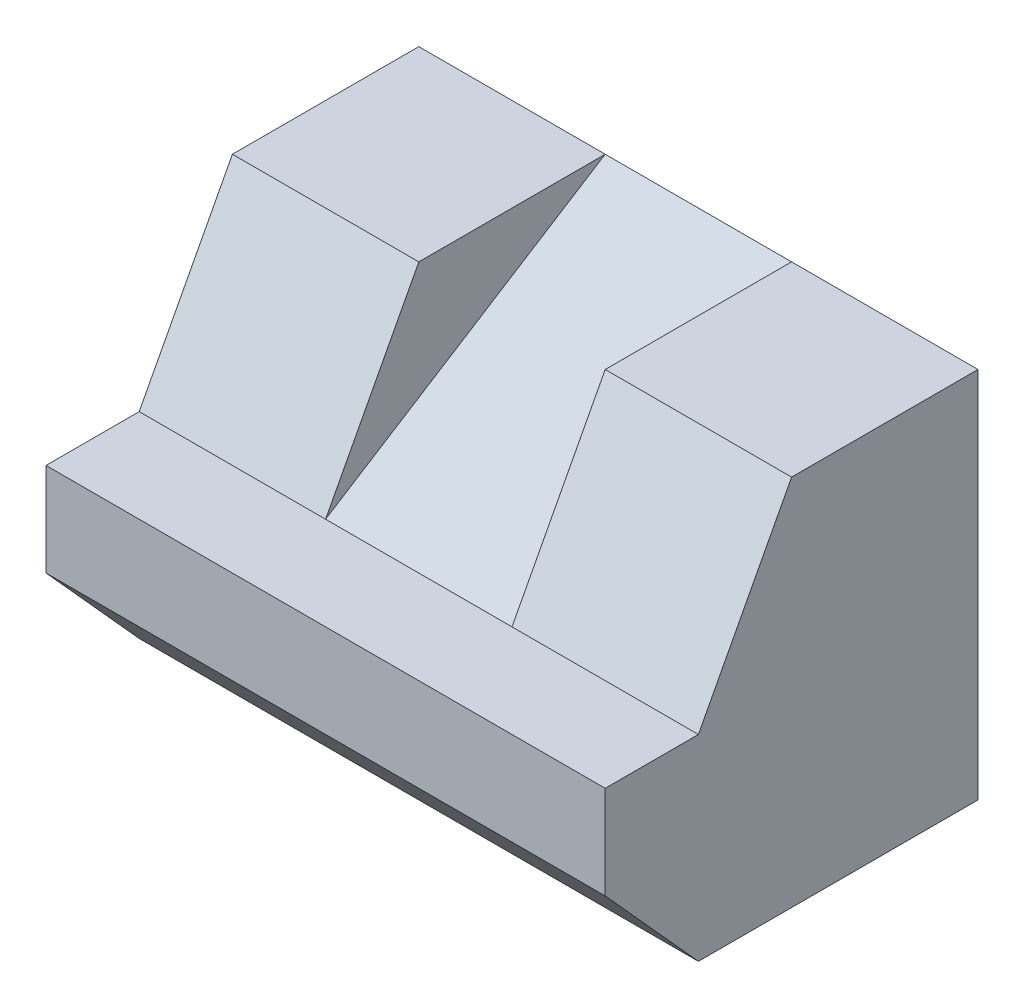
ISO-10303-21;
HEADER;
FILE_DESCRIPTION(('STEP AP214'),'2;1');
FILE_NAME('part.step','',(''),(''),'','','');
FILE_SCHEMA(('AUTOMOTIVE_DESIGN { 1 0 10303 214 1 1 1 1 }'));
ENDSEC;
DATA;
#1=APPLICATION_CONTEXT('core data for automotive mechanical design processes');
#2=APPLICATION_PROTOCOL_DEFINITION('international standard','automotive_design',2000,#1);
#3=PRODUCT_CONTEXT('',#1,'mechanical');
#4=PRODUCT('Part','Part','',(#3));
#5=PRODUCT_RELATED_PRODUCT_CATEGORY('part','',(#4));
#6=PRODUCT_DEFINITION_FORMATION('','',#4);
#7=PRODUCT_DEFINITION_CONTEXT('part definition',#1,'design');
#8=PRODUCT_DEFINITION('design','',#6,#7);
#9=PRODUCT_DEFINITION_SHAPE('','',#8);
#10=(LENGTH_UNIT() NAMED_UNIT(*) SI_UNIT(.MILLI.,.METRE.));
#11=(NAMED_UNIT(*) PLANE_ANGLE_UNIT() SI_UNIT($,.RADIAN.));
#12=(NAMED_UNIT(*) SI_UNIT($,.STERADIAN.) SOLID_ANGLE_UNIT());
#13=UNCERTAINTY_MEASURE_WITH_UNIT(LENGTH_MEASURE(1.E-05),#10,'distance_accuracy_value','');
#14=(GEOMETRIC_REPRESENTATION_CONTEXT(3) GLOBAL_UNCERTAINTY_ASSIGNED_CONTEXT((#13)) GLOBAL_UNIT_ASSIGNED_CONTEXT((#10,
#11,#12)) REPRESENTATION_CONTEXT('',''));
#15=CARTESIAN_POINT('',(0.,0.,0.));
#16=DIRECTION('',(0.,0.,1.));
#17=DIRECTION('',(1.,0.,0.));
#18=AXIS2_PLACEMENT_3D('',#15,#16,#17);
#19=CARTESIAN_POINT('',(76.2,50.8,0.));
#20=DIRECTION('',(0.,-1.,0.));
#21=DIRECTION('',(0.,0.,-1.));
#22=AXIS2_PLACEMENT_3D('',#19,#20,#21);
#23=PLANE('',#22);
#24=DIRECTION('',(0.,0.,1.));
#25=VECTOR('',#24,1.);
#26=CARTESIAN_POINT('',(50.8,50.8,0.));
#27=LINE('',#26,#25);
#28=CARTESIAN_POINT('',(50.8,50.8,0.));
#29=VERTEX_POINT('',#28);
#30=CARTESIAN_POINT('',(50.8,50.8,25.4));
#31=VERTEX_POINT('',#30);
#32=EDGE_CURVE('E208',#29,#31,#27,.T.);
#33=ORIENTED_EDGE('',*,*,#32,.T.);
#34=DIRECTION('',(-1.,0.,0.));
#35=VECTOR('',#34,1.);
#36=CARTESIAN_POINT('',(76.2,50.8,25.4));
#37=LINE('',#36,#35);
#38=CARTESIAN_POINT('',(76.2,50.8,25.4));
#39=VERTEX_POINT('',#38);
#40=EDGE_CURVE('E165',#39,#31,#37,.T.);
#41=ORIENTED_EDGE('',*,*,#40,.F.);
#42=DIRECTION('',(0.,0.,1.));
#43=VECTOR('',#42,1.);
#44=CARTESIAN_POINT('',(76.2,50.8,0.));
#45=LINE('',#44,#43);
#46=CARTESIAN_POINT('',(76.2,50.8,0.));
#47=VERTEX_POINT('',#46);
#48=EDGE_CURVE('E214',#47,#39,#45,.T.);
#49=ORIENTED_EDGE('',*,*,#48,.F.);
#50=DIRECTION('',(-1.,0.,0.));
#51=VECTOR('',#50,1.);
#52=CARTESIAN_POINT('',(76.2,50.8,0.));
#53=LINE('',#52,#51);
#54=EDGE_CURVE('E47',#47,#29,#53,.T.);
#55=ORIENTED_EDGE('',*,*,#54,.T.);
#56=EDGE_LOOP('',(#33,#41,#49,#55));
#57=FACE_BOUND('',#56,.T.);
#58=ADVANCED_FACE('F39',(#57),#23,.F.);
#59=CARTESIAN_POINT('',(76.2,50.8,25.4));
#60=DIRECTION('',(0.,-0.467351473788299,-0.884071603405462));
#61=DIRECTION('',(0.,0.884071603405462,-0.467351473788299));
#62=AXIS2_PLACEMENT_3D('',#59,#60,#61);
#63=PLANE('',#62);
#64=DIRECTION('',(0.,-0.884071603405462,0.467351473788299));
#65=VECTOR('',#64,1.);
#66=CARTESIAN_POINT('',(50.8,50.8,25.4));
#67=LINE('',#66,#65);
#68=CARTESIAN_POINT('',(50.8,26.7758768443826,38.1));
#69=VERTEX_POINT('',#68);
#70=EDGE_CURVE('E206',#31,#69,#67,.T.);
#71=ORIENTED_EDGE('',*,*,#70,.T.);
#72=DIRECTION('',(-1.,0.,0.));
#73=VECTOR('',#72,1.);
#74=CARTESIAN_POINT('',(76.2,26.7758768443826,38.1));
#75=LINE('',#74,#73);
#76=CARTESIAN_POINT('',(76.2,26.7758768443826,38.1));
#77=VERTEX_POINT('',#76);
#78=EDGE_CURVE('E162',#77,#69,#75,.T.);
#79=ORIENTED_EDGE('',*,*,#78,.F.);
#80=DIRECTION('',(0.,-0.884071603405462,0.467351473788299));
#81=VECTOR('',#80,1.);
#82=CARTESIAN_POINT('',(76.2,50.8,25.4));
#83=LINE('',#82,#81);
#84=EDGE_CURVE('E121',#39,#77,#83,.T.);
#85=ORIENTED_EDGE('',*,*,#84,.F.);
#86=ORIENTED_EDGE('',*,*,#40,.T.);
#87=EDGE_LOOP('',(#71,#79,#85,#86));
#88=FACE_BOUND('',#87,.T.);
#89=ADVANCED_FACE('F213',(#88),#63,.F.);
#90=CARTESIAN_POINT('',(76.2,0.,38.1));
#91=DIRECTION('',(0.,1.,0.));
#92=DIRECTION('',(0.,0.,1.));
#93=AXIS2_PLACEMENT_3D('',#90,#91,#92);
#94=PLANE('',#93);
#95=DIRECTION('',(0.,0.,-1.));
#96=VECTOR('',#95,1.);
#97=CARTESIAN_POINT('',(0.,0.,38.1));
#98=LINE('',#97,#96);
#99=CARTESIAN_POINT('',(0.,0.,38.1));
#100=VERTEX_POINT('',#99);
#101=CARTESIAN_POINT('',(0.,0.,0.));
#102=VERTEX_POINT('',#101);
#103=EDGE_CURVE('E142',#100,#102,#98,.T.);
#104=ORIENTED_EDGE('',*,*,#103,.T.);
#105=DIRECTION('',(-1.,0.,0.));
#106=VECTOR('',#105,1.);
#107=CARTESIAN_POINT('',(76.2,0.,0.));
#108=LINE('',#107,#106);
#109=CARTESIAN_POINT('',(76.2,0.,0.));
#110=VERTEX_POINT('',#109);
#111=EDGE_CURVE('E11',#110,#102,#108,.T.);
#112=ORIENTED_EDGE('',*,*,#111,.F.);
#113=DIRECTION('',(0.,0.,-1.));
#114=VECTOR('',#113,1.);
#115=CARTESIAN_POINT('',(76.2,0.,38.1));
#116=LINE('',#115,#114);
#117=CARTESIAN_POINT('',(76.2,0.,38.1));
#118=VERTEX_POINT('',#117);
#119=EDGE_CURVE('E159',#118,#110,#116,.T.);
#120=ORIENTED_EDGE('',*,*,#119,.F.);
#121=DIRECTION('',(-1.,0.,0.));
#122=VECTOR('',#121,1.);
#123=CARTESIAN_POINT('',(76.2,0.,38.1));
#124=LINE('',#123,#122);
#125=EDGE_CURVE('E138',#118,#100,#124,.T.);
#126=ORIENTED_EDGE('',*,*,#125,.T.);
#127=EDGE_LOOP('',(#104,#112,#120,#126));
#128=FACE_BOUND('',#127,.T.);
#129=ADVANCED_FACE('F41',(#128),#94,.F.);
#130=CARTESIAN_POINT('',(76.2,0.,0.));
#131=DIRECTION('',(0.,0.,1.));
#132=DIRECTION('',(1.,0.,0.));
#133=AXIS2_PLACEMENT_3D('',#130,#131,#132);
#134=PLANE('',#133);
#135=DIRECTION('',(0.,1.,0.));
#136=VECTOR('',#135,1.);
#137=CARTESIAN_POINT('',(0.,0.,0.));
#138=LINE('',#137,#136);
#139=CARTESIAN_POINT('',(0.,50.8,0.));
#140=VERTEX_POINT('',#139);
#141=EDGE_CURVE('E145',#102,#140,#138,.T.);
#142=ORIENTED_EDGE('',*,*,#141,.T.);
#143=CARTESIAN_POINT('',(25.4,50.8,0.));
#144=VERTEX_POINT('',#143);
#145=EDGE_CURVE('E167',#144,#140,#53,.T.);
#146=ORIENTED_EDGE('',*,*,#145,.F.);
#147=DIRECTION('',(1.,0.,0.));
#148=VECTOR('',#147,1.);
#149=CARTESIAN_POINT('',(25.4,50.8,0.));
#150=LINE('',#149,#148);
#151=EDGE_CURVE('E146',#144,#29,#150,.T.);
#152=ORIENTED_EDGE('',*,*,#151,.T.);
#153=ORIENTED_EDGE('',*,*,#54,.F.);
#154=DIRECTION('',(0.,1.,0.));
#155=VECTOR('',#154,1.);
#156=CARTESIAN_POINT('',(76.2,0.,0.));
#157=LINE('',#156,#155);
#158=EDGE_CURVE('E101',#110,#47,#157,.T.);
#159=ORIENTED_EDGE('',*,*,#158,.F.);
#160=ORIENTED_EDGE('',*,*,#111,.T.);
#161=EDGE_LOOP('',(#142,#146,#152,#153,#159,#160));
#162=FACE_BOUND('',#161,.T.);
#163=ADVANCED_FACE('F183',(#162),#134,.F.);
#164=CARTESIAN_POINT('',(25.4,50.8,25.4));
#165=VERTEX_POINT('',#164);
#166=CARTESIAN_POINT('',(0.,50.8,25.4));
#167=VERTEX_POINT('',#166);
#168=EDGE_CURVE('E164',#165,#167,#37,.T.);
#169=ORIENTED_EDGE('',*,*,#168,.F.);
#170=DIRECTION('',(0.,0.,1.));
#171=VECTOR('',#170,1.);
#172=CARTESIAN_POINT('',(25.4,50.8,0.));
#173=LINE('',#172,#171);
#174=EDGE_CURVE('E181',#144,#165,#173,.T.);
#175=ORIENTED_EDGE('',*,*,#174,.F.);
#176=ORIENTED_EDGE('',*,*,#145,.T.);
#177=DIRECTION('',(0.,0.,1.));
#178=VECTOR('',#177,1.);
#179=CARTESIAN_POINT('',(0.,50.8,0.));
#180=LINE('',#179,#178);
#181=EDGE_CURVE('E149',#140,#167,#180,.T.);
#182=ORIENTED_EDGE('',*,*,#181,.T.);
#183=EDGE_LOOP('',(#169,#175,#176,#182));
#184=FACE_BOUND('',#183,.T.);
#185=ADVANCED_FACE('F177',(#184),#23,.F.);
#186=CARTESIAN_POINT('',(25.4,26.7758768443826,38.1));
#187=VERTEX_POINT('',#186);
#188=CARTESIAN_POINT('',(0.,26.7758768443826,38.1));
#189=VERTEX_POINT('',#188);
#190=EDGE_CURVE('E133',#187,#189,#75,.T.);
#191=ORIENTED_EDGE('',*,*,#190,.F.);
#192=DIRECTION('',(0.,-0.884071603405462,0.467351473788299));
#193=VECTOR('',#192,1.);
#194=CARTESIAN_POINT('',(25.4,50.8,25.4));
#195=LINE('',#194,#193);
#196=EDGE_CURVE('E54',#165,#187,#195,.T.);
#197=ORIENTED_EDGE('',*,*,#196,.F.);
#198=ORIENTED_EDGE('',*,*,#168,.T.);
#199=DIRECTION('',(0.,-0.884071603405462,0.467351473788299));
#200=VECTOR('',#199,1.);
#201=CARTESIAN_POINT('',(0.,50.8,25.4));
#202=LINE('',#201,#200);
#203=EDGE_CURVE('E152',#167,#189,#202,.T.);
#204=ORIENTED_EDGE('',*,*,#203,.T.);
#205=EDGE_LOOP('',(#191,#197,#198,#204));
#206=FACE_BOUND('',#205,.T.);
#207=ADVANCED_FACE('F190',(#206),#63,.F.);
#208=CARTESIAN_POINT('',(76.2,26.7758768443826,38.1));
#209=DIRECTION('',(0.,-1.,0.));
#210=DIRECTION('',(0.,0.,-1.));
#211=AXIS2_PLACEMENT_3D('',#208,#209,#210);
#212=PLANE('',#211);
#213=DIRECTION('',(0.,0.,1.));
#214=VECTOR('',#213,1.);
#215=CARTESIAN_POINT('',(0.,26.7758768443826,38.1));
#216=LINE('',#215,#214);
#217=CARTESIAN_POINT('',(0.,26.7758768443826,50.8));
#218=VERTEX_POINT('',#217);
#219=EDGE_CURVE('E130',#189,#218,#216,.T.);
#220=ORIENTED_EDGE('',*,*,#219,.T.);
#221=DIRECTION('',(-1.,0.,0.));
#222=VECTOR('',#221,1.);
#223=CARTESIAN_POINT('',(76.2,26.7758768443826,50.8));
#224=LINE('',#223,#222);
#225=CARTESIAN_POINT('',(76.2,26.7758768443826,50.8));
#226=VERTEX_POINT('',#225);
#227=EDGE_CURVE('E127',#226,#218,#224,.T.);
#228=ORIENTED_EDGE('',*,*,#227,.F.);
#229=DIRECTION('',(0.,0.,1.));
#230=VECTOR('',#229,1.);
#231=CARTESIAN_POINT('',(76.2,26.7758768443826,38.1));
#232=LINE('',#231,#230);
#233=EDGE_CURVE('E114',#77,#226,#232,.T.);
#234=ORIENTED_EDGE('',*,*,#233,.F.);
#235=ORIENTED_EDGE('',*,*,#78,.T.);
#236=DIRECTION('',(1.,0.,0.));
#237=VECTOR('',#236,1.);
#238=CARTESIAN_POINT('',(25.4,26.7758768443826,38.1));
#239=LINE('',#238,#237);
#240=EDGE_CURVE('E219',#187,#69,#239,.T.);
#241=ORIENTED_EDGE('',*,*,#240,.F.);
#242=ORIENTED_EDGE('',*,*,#190,.T.);
#243=EDGE_LOOP('',(#220,#228,#234,#235,#241,#242));
#244=FACE_BOUND('',#243,.T.);
#245=ADVANCED_FACE('F128',(#244),#212,.F.);
#246=CARTESIAN_POINT('',(76.2,26.7758768443826,50.8));
#247=DIRECTION('',(0.,0.,-1.));
#248=DIRECTION('',(-1.,0.,0.));
#249=AXIS2_PLACEMENT_3D('',#246,#247,#248);
#250=PLANE('',#249);
#251=DIRECTION('',(0.,-1.,0.));
#252=VECTOR('',#251,1.);
#253=CARTESIAN_POINT('',(0.,26.7758768443826,50.8));
#254=LINE('',#253,#252);
#255=CARTESIAN_POINT('',(0.,14.0758768443826,50.8));
#256=VERTEX_POINT('',#255);
#257=EDGE_CURVE('E156',#218,#256,#254,.T.);
#258=ORIENTED_EDGE('',*,*,#257,.T.);
#259=DIRECTION('',(-1.,0.,0.));
#260=VECTOR('',#259,1.);
#261=CARTESIAN_POINT('',(76.2,14.0758768443826,50.8));
#262=LINE('',#261,#260);
#263=CARTESIAN_POINT('',(76.2,14.0758768443826,50.8));
#264=VERTEX_POINT('',#263);
#265=EDGE_CURVE('E134',#264,#256,#262,.T.);
#266=ORIENTED_EDGE('',*,*,#265,.F.);
#267=DIRECTION('',(0.,-1.,0.));
#268=VECTOR('',#267,1.);
#269=CARTESIAN_POINT('',(76.2,26.7758768443826,50.8));
#270=LINE('',#269,#268);
#271=EDGE_CURVE('E118',#226,#264,#270,.T.);
#272=ORIENTED_EDGE('',*,*,#271,.F.);
#273=ORIENTED_EDGE('',*,*,#227,.T.);
#274=EDGE_LOOP('',(#258,#266,#272,#273));
#275=FACE_BOUND('',#274,.T.);
#276=ADVANCED_FACE('F136',(#275),#250,.F.);
#277=CARTESIAN_POINT('',(76.2,14.0758768443826,50.8));
#278=DIRECTION('',(0.,0.669888333530101,-0.742461864744758));
#279=DIRECTION('',(0.,0.742461864744758,0.669888333530101));
#280=AXIS2_PLACEMENT_3D('',#277,#278,#279);
#281=PLANE('',#280);
#282=DIRECTION('',(0.,-0.742461864744759,-0.669888333530101));
#283=VECTOR('',#282,1.);
#284=CARTESIAN_POINT('',(0.,14.0758768443826,50.8));
#285=LINE('',#284,#283);
#286=EDGE_CURVE('E93',#256,#100,#285,.T.);
#287=ORIENTED_EDGE('',*,*,#286,.T.);
#288=ORIENTED_EDGE('',*,*,#125,.F.);
#289=DIRECTION('',(0.,-0.742461864744759,-0.669888333530101));
#290=VECTOR('',#289,1.);
#291=CARTESIAN_POINT('',(76.2,14.0758768443826,50.8));
#292=LINE('',#291,#290);
#293=EDGE_CURVE('E63',#264,#118,#292,.T.);
#294=ORIENTED_EDGE('',*,*,#293,.F.);
#295=ORIENTED_EDGE('',*,*,#265,.T.);
#296=EDGE_LOOP('',(#287,#288,#294,#295));
#297=FACE_BOUND('',#296,.T.);
#298=ADVANCED_FACE('F230',(#297),#281,.F.);
#299=CARTESIAN_POINT('',(76.2,0.,0.));
#300=DIRECTION('',(1.,0.,0.));
#301=DIRECTION('',(0.,0.,-1.));
#302=AXIS2_PLACEMENT_3D('',#299,#300,#301);
#303=PLANE('',#302);
#304=ORIENTED_EDGE('',*,*,#119,.T.);
#305=ORIENTED_EDGE('',*,*,#158,.T.);
#306=ORIENTED_EDGE('',*,*,#48,.T.);
#307=ORIENTED_EDGE('',*,*,#84,.T.);
#308=ORIENTED_EDGE('',*,*,#233,.T.);
#309=ORIENTED_EDGE('',*,*,#271,.T.);
#310=ORIENTED_EDGE('',*,*,#293,.T.);
#311=EDGE_LOOP('',(#304,#305,#306,#307,#308,#309,#310));
#312=FACE_BOUND('',#311,.T.);
#313=ADVANCED_FACE('F116',(#312),#303,.T.);
#314=CARTESIAN_POINT('',(0.,0.,0.));
#315=DIRECTION('',(1.,0.,0.));
#316=DIRECTION('',(0.,0.,-1.));
#317=AXIS2_PLACEMENT_3D('',#314,#315,#316);
#318=PLANE('',#317);
#319=ORIENTED_EDGE('',*,*,#103,.F.);
#320=ORIENTED_EDGE('',*,*,#286,.F.);
#321=ORIENTED_EDGE('',*,*,#257,.F.);
#322=ORIENTED_EDGE('',*,*,#219,.F.);
#323=ORIENTED_EDGE('',*,*,#203,.F.);
#324=ORIENTED_EDGE('',*,*,#181,.F.);
#325=ORIENTED_EDGE('',*,*,#141,.F.);
#326=EDGE_LOOP('',(#319,#320,#321,#322,#323,#324,#325));
#327=FACE_BOUND('',#326,.T.);
#328=ADVANCED_FACE('F187',(#327),#318,.F.);
#329=CARTESIAN_POINT('',(25.4,26.7758768443826,38.1));
#330=DIRECTION('',(0.,-0.84587994782369,-0.533373334419515));
#331=DIRECTION('',(0.,0.533373334419515,-0.84587994782369));
#332=AXIS2_PLACEMENT_3D('',#329,#330,#331);
#333=PLANE('',#332);
#334=DIRECTION('',(0.,0.533373334419515,-0.84587994782369));
#335=VECTOR('',#334,1.);
#336=CARTESIAN_POINT('',(50.8,26.7758768443826,38.1));
#337=LINE('',#336,#335);
#338=EDGE_CURVE('E201',#69,#29,#337,.T.);
#339=ORIENTED_EDGE('',*,*,#338,.T.);
#340=ORIENTED_EDGE('',*,*,#151,.F.);
#341=DIRECTION('',(0.,0.533373334419515,-0.84587994782369));
#342=VECTOR('',#341,1.);
#343=CARTESIAN_POINT('',(25.4,26.7758768443826,38.1));
#344=LINE('',#343,#342);
#345=EDGE_CURVE('E224',#187,#144,#344,.T.);
#346=ORIENTED_EDGE('',*,*,#345,.F.);
#347=ORIENTED_EDGE('',*,*,#240,.T.);
#348=EDGE_LOOP('',(#339,#340,#346,#347));
#349=FACE_BOUND('',#348,.T.);
#350=ADVANCED_FACE('F227',(#349),#333,.F.);
#351=CARTESIAN_POINT('',(25.4,0.,0.));
#352=DIRECTION('',(-1.,0.,0.));
#353=DIRECTION('',(0.,0.,1.));
#354=AXIS2_PLACEMENT_3D('',#351,#352,#353);
#355=PLANE('',#354);
#356=ORIENTED_EDGE('',*,*,#196,.T.);
#357=ORIENTED_EDGE('',*,*,#345,.T.);
#358=ORIENTED_EDGE('',*,*,#174,.T.);
#359=EDGE_LOOP('',(#356,#357,#358));
#360=FACE_BOUND('',#359,.T.);
#361=ADVANCED_FACE('F226',(#360),#355,.F.);
#362=CARTESIAN_POINT('',(50.8,0.,0.));
#363=DIRECTION('',(-1.,0.,0.));
#364=DIRECTION('',(0.,0.,1.));
#365=AXIS2_PLACEMENT_3D('',#362,#363,#364);
#366=PLANE('',#365);
#367=ORIENTED_EDGE('',*,*,#70,.F.);
#368=ORIENTED_EDGE('',*,*,#32,.F.);
#369=ORIENTED_EDGE('',*,*,#338,.F.);
#370=EDGE_LOOP('',(#367,#368,#369));
#371=FACE_BOUND('',#370,.T.);
#372=ADVANCED_FACE('F207',(#371),#366,.T.);
#373=CLOSED_SHELL('',(#58,#89,#129,#163,#185,#207,#245,#276,#298,#313,#328,#350,#361,#372));
#374=MANIFOLD_SOLID_BREP('B2',#373);
#375=ADVANCED_BREP_SHAPE_REPRESENTATION('',(#18,#374),#14);
#376=SHAPE_DEFINITION_REPRESENTATION(#9,#375);
ENDSEC;
END-ISO-10303-21;
